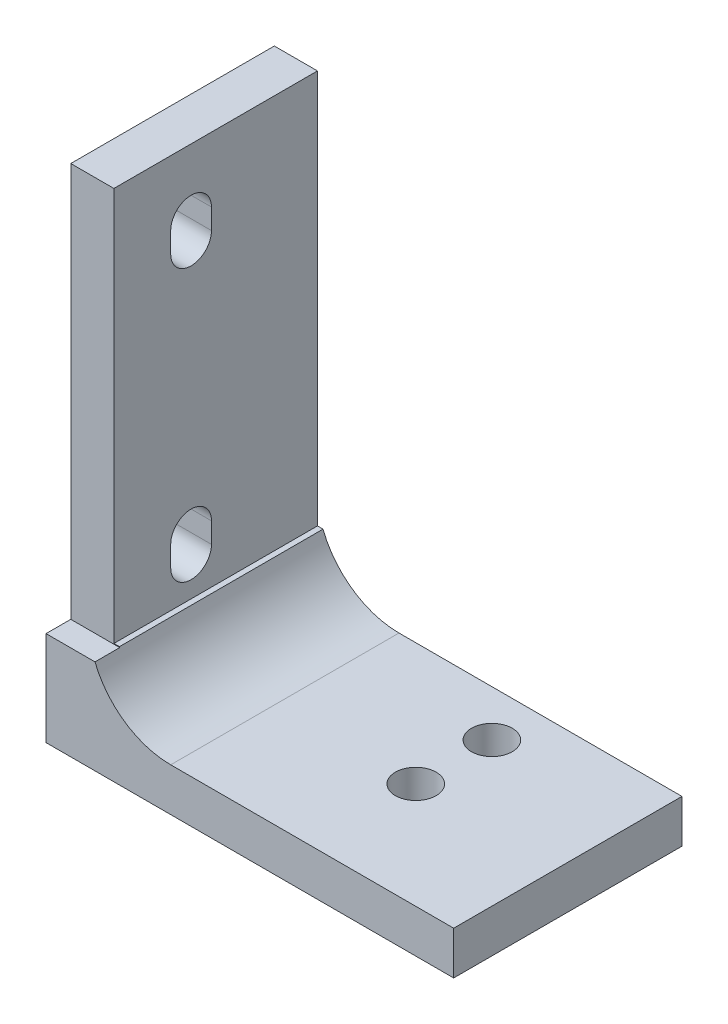
ISO-10303-21;
HEADER;
FILE_DESCRIPTION(('STEP AP214'),'2;1');
FILE_NAME('part.step','',(''),(''),'','','');
FILE_SCHEMA(('AUTOMOTIVE_DESIGN { 1 0 10303 214 1 1 1 1 }'));
ENDSEC;
DATA;
#1=APPLICATION_CONTEXT('core data for automotive mechanical design processes');
#2=APPLICATION_PROTOCOL_DEFINITION('international standard','automotive_design',2000,#1);
#3=PRODUCT_CONTEXT('',#1,'mechanical');
#4=PRODUCT('Part','Part','',(#3));
#5=PRODUCT_RELATED_PRODUCT_CATEGORY('part','',(#4));
#6=PRODUCT_DEFINITION_FORMATION('','',#4);
#7=PRODUCT_DEFINITION_CONTEXT('part definition',#1,'design');
#8=PRODUCT_DEFINITION('design','',#6,#7);
#9=PRODUCT_DEFINITION_SHAPE('','',#8);
#10=(LENGTH_UNIT() NAMED_UNIT(*) SI_UNIT(.MILLI.,.METRE.));
#11=(NAMED_UNIT(*) PLANE_ANGLE_UNIT() SI_UNIT($,.RADIAN.));
#12=(NAMED_UNIT(*) SI_UNIT($,.STERADIAN.) SOLID_ANGLE_UNIT());
#13=UNCERTAINTY_MEASURE_WITH_UNIT(LENGTH_MEASURE(1.E-05),#10,'distance_accuracy_value','');
#14=(GEOMETRIC_REPRESENTATION_CONTEXT(3) GLOBAL_UNCERTAINTY_ASSIGNED_CONTEXT((#13)) GLOBAL_UNIT_ASSIGNED_CONTEXT((#10,
#11,#12)) REPRESENTATION_CONTEXT('',''));
#15=CARTESIAN_POINT('',(0.,0.,0.));
#16=DIRECTION('',(0.,0.,1.));
#17=DIRECTION('',(1.,0.,0.));
#18=AXIS2_PLACEMENT_3D('',#15,#16,#17);
#19=CARTESIAN_POINT('',(0.,0.,-8.4));
#20=DIRECTION('',(0.,0.,1.));
#21=DIRECTION('',(1.,0.,0.));
#22=AXIS2_PLACEMENT_3D('',#19,#20,#21);
#23=PLANE('',#22);
#24=DIRECTION('',(0.,1.,0.));
#25=VECTOR('',#24,1.);
#26=CARTESIAN_POINT('',(3.175,3.175,-8.4));
#27=LINE('',#26,#25);
#28=CARTESIAN_POINT('',(3.175,7.,-8.4));
#29=VERTEX_POINT('',#28);
#30=CARTESIAN_POINT('',(3.175,36.,-8.4));
#31=VERTEX_POINT('',#30);
#32=EDGE_CURVE('E304',#29,#31,#27,.T.);
#33=ORIENTED_EDGE('',*,*,#32,.F.);
#34=DIRECTION('',(-1.,0.,0.));
#35=VECTOR('',#34,1.);
#36=CARTESIAN_POINT('',(0.,7.,-8.4));
#37=LINE('',#36,#35);
#38=CARTESIAN_POINT('',(3.58309737209239,7.,-8.4));
#39=VERTEX_POINT('',#38);
#40=EDGE_CURVE('E241',#39,#29,#37,.T.);
#41=ORIENTED_EDGE('',*,*,#40,.F.);
#42=CARTESIAN_POINT('',(9.175,9.175,-8.4));
#43=DIRECTION('',(0.,0.,1.));
#44=DIRECTION('',(1.,0.,0.));
#45=AXIS2_PLACEMENT_3D('',#42,#43,#44);
#46=CIRCLE('',#45,6.);
#47=CARTESIAN_POINT('',(9.175,3.175,-8.4));
#48=VERTEX_POINT('',#47);
#49=EDGE_CURVE('E202',#39,#48,#46,.T.);
#50=ORIENTED_EDGE('',*,*,#49,.T.);
#51=DIRECTION('',(-1.,0.,0.));
#52=VECTOR('',#51,1.);
#53=CARTESIAN_POINT('',(3.175,3.175,-8.4));
#54=LINE('',#53,#52);
#55=CARTESIAN_POINT('',(30.,3.175,-8.4));
#56=VERTEX_POINT('',#55);
#57=EDGE_CURVE('E301',#56,#48,#54,.T.);
#58=ORIENTED_EDGE('',*,*,#57,.F.);
#59=DIRECTION('',(0.,1.,0.));
#60=VECTOR('',#59,1.);
#61=CARTESIAN_POINT('',(30.,0.,-8.4));
#62=LINE('',#61,#60);
#63=CARTESIAN_POINT('',(30.,0.,-8.4));
#64=VERTEX_POINT('',#63);
#65=EDGE_CURVE('E298',#64,#56,#62,.T.);
#66=ORIENTED_EDGE('',*,*,#65,.F.);
#67=DIRECTION('',(1.,0.,0.));
#68=VECTOR('',#67,1.);
#69=CARTESIAN_POINT('',(0.,0.,-8.4));
#70=LINE('',#69,#68);
#71=CARTESIAN_POINT('',(0.,0.,-8.4));
#72=VERTEX_POINT('',#71);
#73=EDGE_CURVE('E295',#72,#64,#70,.T.);
#74=ORIENTED_EDGE('',*,*,#73,.F.);
#75=DIRECTION('',(0.,-1.,0.));
#76=VECTOR('',#75,1.);
#77=CARTESIAN_POINT('',(0.,0.,-8.4));
#78=LINE('',#77,#76);
#79=CARTESIAN_POINT('',(0.,36.,-8.4));
#80=VERTEX_POINT('',#79);
#81=EDGE_CURVE('E196',#80,#72,#78,.T.);
#82=ORIENTED_EDGE('',*,*,#81,.F.);
#83=DIRECTION('',(-1.,0.,0.));
#84=VECTOR('',#83,1.);
#85=CARTESIAN_POINT('',(0.,36.,-8.4));
#86=LINE('',#85,#84);
#87=EDGE_CURVE('E181',#31,#80,#86,.T.);
#88=ORIENTED_EDGE('',*,*,#87,.F.);
#89=EDGE_LOOP('',(#33,#41,#50,#58,#66,#74,#82,#88));
#90=FACE_BOUND('',#89,.T.);
#91=ADVANCED_FACE('F32',(#90),#23,.F.);
#92=CARTESIAN_POINT('',(0.,0.,8.4));
#93=DIRECTION('',(0.,0.,1.));
#94=DIRECTION('',(1.,0.,0.));
#95=AXIS2_PLACEMENT_3D('',#92,#93,#94);
#96=PLANE('',#95);
#97=DIRECTION('',(-1.,0.,0.));
#98=VECTOR('',#97,1.);
#99=CARTESIAN_POINT('',(7.,6.95,8.4));
#100=LINE('',#99,#98);
#101=CARTESIAN_POINT('',(3.60280339542833,6.95,8.4));
#102=VERTEX_POINT('',#101);
#103=CARTESIAN_POINT('',(0.,6.95,8.4));
#104=VERTEX_POINT('',#103);
#105=EDGE_CURVE('E319',#102,#104,#100,.T.);
#106=ORIENTED_EDGE('',*,*,#105,.T.);
#107=DIRECTION('',(0.,-1.,0.));
#108=VECTOR('',#107,1.);
#109=CARTESIAN_POINT('',(0.,0.,8.4));
#110=LINE('',#109,#108);
#111=CARTESIAN_POINT('',(0.,0.,8.4));
#112=VERTEX_POINT('',#111);
#113=EDGE_CURVE('E293',#104,#112,#110,.T.);
#114=ORIENTED_EDGE('',*,*,#113,.T.);
#115=DIRECTION('',(1.,0.,0.));
#116=VECTOR('',#115,1.);
#117=CARTESIAN_POINT('',(0.,0.,8.4));
#118=LINE('',#117,#116);
#119=CARTESIAN_POINT('',(30.,0.,8.4));
#120=VERTEX_POINT('',#119);
#121=EDGE_CURVE('E278',#112,#120,#118,.T.);
#122=ORIENTED_EDGE('',*,*,#121,.T.);
#123=DIRECTION('',(0.,1.,0.));
#124=VECTOR('',#123,1.);
#125=CARTESIAN_POINT('',(30.,0.,8.4));
#126=LINE('',#125,#124);
#127=CARTESIAN_POINT('',(30.,3.175,8.4));
#128=VERTEX_POINT('',#127);
#129=EDGE_CURVE('E287',#120,#128,#126,.T.);
#130=ORIENTED_EDGE('',*,*,#129,.T.);
#131=DIRECTION('',(-1.,0.,0.));
#132=VECTOR('',#131,1.);
#133=CARTESIAN_POINT('',(3.175,3.175,8.4));
#134=LINE('',#133,#132);
#135=CARTESIAN_POINT('',(9.175,3.175,8.4));
#136=VERTEX_POINT('',#135);
#137=EDGE_CURVE('E290',#128,#136,#134,.T.);
#138=ORIENTED_EDGE('',*,*,#137,.T.);
#139=CARTESIAN_POINT('',(9.175,9.175,8.4));
#140=DIRECTION('',(0.,0.,1.));
#141=DIRECTION('',(1.,0.,0.));
#142=AXIS2_PLACEMENT_3D('',#139,#140,#141);
#143=CIRCLE('',#142,6.);
#144=EDGE_CURVE('E199',#136,#102,#143,.F.);
#145=ORIENTED_EDGE('',*,*,#144,.T.);
#146=EDGE_LOOP('',(#106,#114,#122,#130,#138,#145));
#147=FACE_BOUND('',#146,.T.);
#148=ADVANCED_FACE('F317',(#147),#96,.T.);
#149=CARTESIAN_POINT('',(9.175,9.175,-8.4));
#150=DIRECTION('',(0.,0.,-1.));
#151=DIRECTION('',(-1.,0.,0.));
#152=AXIS2_PLACEMENT_3D('',#149,#150,#151);
#153=CYLINDRICAL_SURFACE('',#152,6.);
#154=CARTESIAN_POINT('',(9.175,9.175,6.58));
#155=DIRECTION('',(0.,0.,-1.));
#156=DIRECTION('',(0.,1.,0.));
#157=AXIS2_PLACEMENT_3D('',#154,#155,#156);
#158=CIRCLE('',#157,6.);
#159=CARTESIAN_POINT('',(3.58309737209239,7.,6.58));
#160=VERTEX_POINT('',#159);
#161=CARTESIAN_POINT('',(3.60280339542833,6.95,6.58));
#162=VERTEX_POINT('',#161);
#163=EDGE_CURVE('E46',#160,#162,#158,.F.);
#164=ORIENTED_EDGE('',*,*,#163,.T.);
#165=DIRECTION('',(0.,0.,-1.));
#166=VECTOR('',#165,1.);
#167=CARTESIAN_POINT('',(3.60280339542833,6.95,-8.4));
#168=LINE('',#167,#166);
#169=EDGE_CURVE('E232',#162,#102,#168,.F.);
#170=ORIENTED_EDGE('',*,*,#169,.T.);
#171=ORIENTED_EDGE('',*,*,#144,.F.);
#172=DIRECTION('',(0.,0.,1.));
#173=VECTOR('',#172,1.);
#174=CARTESIAN_POINT('',(9.175,3.175,8.4));
#175=LINE('',#174,#173);
#176=EDGE_CURVE('E187',#48,#136,#175,.T.);
#177=ORIENTED_EDGE('',*,*,#176,.F.);
#178=ORIENTED_EDGE('',*,*,#49,.F.);
#179=DIRECTION('',(0.,0.,-1.));
#180=VECTOR('',#179,1.);
#181=CARTESIAN_POINT('',(3.58309737209239,7.,-8.4));
#182=LINE('',#181,#180);
#183=EDGE_CURVE('E40',#160,#39,#182,.T.);
#184=ORIENTED_EDGE('',*,*,#183,.F.);
#185=EDGE_LOOP('',(#164,#170,#171,#177,#178,#184));
#186=FACE_BOUND('',#185,.T.);
#187=ADVANCED_FACE('F34',(#186),#153,.F.);
#188=CARTESIAN_POINT('',(10.,9.72499999999903,0.899999999999977));
#189=DIRECTION('',(-1.,0.,0.));
#190=DIRECTION('',(0.,0.,1.));
#191=AXIS2_PLACEMENT_3D('',#188,#189,#190);
#192=CYLINDRICAL_SURFACE('',#191,1.5);
#193=CARTESIAN_POINT('',(3.175,9.72499999999903,0.899999999999977));
#194=DIRECTION('',(1.,0.,0.));
#195=DIRECTION('',(0.,0.,-1.));
#196=AXIS2_PLACEMENT_3D('',#193,#194,#195);
#197=CIRCLE('',#196,1.5);
#198=CARTESIAN_POINT('',(3.175,9.72499999999903,2.39999999999998));
#199=VERTEX_POINT('',#198);
#200=CARTESIAN_POINT('',(3.175,9.72499999999903,-0.600000000000023));
#201=VERTEX_POINT('',#200);
#202=EDGE_CURVE('E257',#199,#201,#197,.T.);
#203=ORIENTED_EDGE('',*,*,#202,.T.);
#204=DIRECTION('',(-1.,0.,0.));
#205=VECTOR('',#204,1.);
#206=CARTESIAN_POINT('',(10.,9.72499999999903,-0.600000000000023));
#207=LINE('',#206,#205);
#208=CARTESIAN_POINT('',(0.,9.72499999999903,-0.600000000000023));
#209=VERTEX_POINT('',#208);
#210=EDGE_CURVE('E255',#201,#209,#207,.T.);
#211=ORIENTED_EDGE('',*,*,#210,.T.);
#212=CARTESIAN_POINT('',(0.,9.72499999999903,0.899999999999977));
#213=DIRECTION('',(-1.,0.,0.));
#214=DIRECTION('',(0.,0.,1.));
#215=AXIS2_PLACEMENT_3D('',#212,#213,#214);
#216=CIRCLE('',#215,1.5);
#217=CARTESIAN_POINT('',(0.,9.72499999999903,2.39999999999998));
#218=VERTEX_POINT('',#217);
#219=EDGE_CURVE('E54',#209,#218,#216,.T.);
#220=ORIENTED_EDGE('',*,*,#219,.T.);
#221=DIRECTION('',(-1.,0.,0.));
#222=VECTOR('',#221,1.);
#223=CARTESIAN_POINT('',(10.,9.72499999999903,2.39999999999998));
#224=LINE('',#223,#222);
#225=EDGE_CURVE('E254',#199,#218,#224,.T.);
#226=ORIENTED_EDGE('',*,*,#225,.F.);
#227=EDGE_LOOP('',(#203,#211,#220,#226));
#228=FACE_BOUND('',#227,.T.);
#229=ADVANCED_FACE('F391',(#228),#192,.F.);
#230=CARTESIAN_POINT('',(0.,0.,-8.4));
#231=DIRECTION('',(0.,-1.,0.));
#232=DIRECTION('',(0.,0.,-1.));
#233=AXIS2_PLACEMENT_3D('',#230,#231,#232);
#234=PLANE('',#233);
#235=CARTESIAN_POINT('',(19.4100000000006,0.,0.600000000000013));
#236=DIRECTION('',(0.,-1.,0.));
#237=DIRECTION('',(0.,0.,-1.));
#238=AXIS2_PLACEMENT_3D('',#235,#236,#237);
#239=CIRCLE('',#238,1.5);
#240=CARTESIAN_POINT('',(19.4100000000006,0.,-0.899999999999991));
#241=VERTEX_POINT('',#240);
#242=EDGE_CURVE('E226',#241,#241,#239,.T.);
#243=ORIENTED_EDGE('',*,*,#242,.F.);
#244=EDGE_LOOP('',(#243));
#245=FACE_BOUND('',#244,.T.);
#246=CARTESIAN_POINT('',(19.4100000000006,0.,-4.99999999999999));
#247=DIRECTION('',(0.,-1.,0.));
#248=DIRECTION('',(0.,0.,-1.));
#249=AXIS2_PLACEMENT_3D('',#246,#247,#248);
#250=CIRCLE('',#249,1.5);
#251=CARTESIAN_POINT('',(19.4100000000006,0.,-6.49999999999999));
#252=VERTEX_POINT('',#251);
#253=EDGE_CURVE('E223',#252,#252,#250,.T.);
#254=ORIENTED_EDGE('',*,*,#253,.F.);
#255=EDGE_LOOP('',(#254));
#256=FACE_BOUND('',#255,.T.);
#257=DIRECTION('',(0.,0.,1.));
#258=VECTOR('',#257,1.);
#259=CARTESIAN_POINT('',(30.,0.,-8.4));
#260=LINE('',#259,#258);
#261=EDGE_CURVE('E194',#64,#120,#260,.T.);
#262=ORIENTED_EDGE('',*,*,#261,.T.);
#263=ORIENTED_EDGE('',*,*,#121,.F.);
#264=DIRECTION('',(0.,0.,1.));
#265=VECTOR('',#264,1.);
#266=CARTESIAN_POINT('',(0.,0.,-8.4));
#267=LINE('',#266,#265);
#268=EDGE_CURVE('E183',#72,#112,#267,.T.);
#269=ORIENTED_EDGE('',*,*,#268,.F.);
#270=ORIENTED_EDGE('',*,*,#73,.T.);
#271=EDGE_LOOP('',(#262,#263,#269,#270));
#272=FACE_BOUND('',#271,.T.);
#273=ADVANCED_FACE('F313',(#245,#256,#272),#234,.T.);
#274=CARTESIAN_POINT('',(0.,0.,-8.4));
#275=DIRECTION('',(-1.,0.,0.));
#276=DIRECTION('',(0.,0.,1.));
#277=AXIS2_PLACEMENT_3D('',#274,#275,#276);
#278=PLANE('',#277);
#279=DIRECTION('',(0.,0.,1.));
#280=VECTOR('',#279,1.);
#281=CARTESIAN_POINT('',(0.,6.95,8.4));
#282=LINE('',#281,#280);
#283=CARTESIAN_POINT('',(0.,6.95,6.58));
#284=VERTEX_POINT('',#283);
#285=EDGE_CURVE('E169',#284,#104,#282,.T.);
#286=ORIENTED_EDGE('',*,*,#285,.F.);
#287=DIRECTION('',(0.,-1.,0.));
#288=VECTOR('',#287,1.);
#289=CARTESIAN_POINT('',(0.,36.,6.58));
#290=LINE('',#289,#288);
#291=CARTESIAN_POINT('',(0.,36.,6.58));
#292=VERTEX_POINT('',#291);
#293=EDGE_CURVE('E160',#292,#284,#290,.T.);
#294=ORIENTED_EDGE('',*,*,#293,.F.);
#295=DIRECTION('',(0.,0.,1.));
#296=VECTOR('',#295,1.);
#297=CARTESIAN_POINT('',(0.,36.,-8.4));
#298=LINE('',#297,#296);
#299=EDGE_CURVE('E175',#80,#292,#298,.T.);
#300=ORIENTED_EDGE('',*,*,#299,.F.);
#301=ORIENTED_EDGE('',*,*,#81,.T.);
#302=ORIENTED_EDGE('',*,*,#268,.T.);
#303=ORIENTED_EDGE('',*,*,#113,.F.);
#304=EDGE_LOOP('',(#286,#294,#300,#301,#302,#303));
#305=FACE_BOUND('',#304,.T.);
#306=ORIENTED_EDGE('',*,*,#219,.F.);
#307=DIRECTION('',(0.,-1.,0.));
#308=VECTOR('',#307,1.);
#309=CARTESIAN_POINT('',(0.,9.72499999999903,-0.600000000000023));
#310=LINE('',#309,#308);
#311=CARTESIAN_POINT('',(0.,11.224999999999,-0.600000000000023));
#312=VERTEX_POINT('',#311);
#313=EDGE_CURVE('E251',#312,#209,#310,.T.);
#314=ORIENTED_EDGE('',*,*,#313,.F.);
#315=CARTESIAN_POINT('',(0.,11.224999999999,0.899999999999977));
#316=DIRECTION('',(-1.,0.,0.));
#317=DIRECTION('',(0.,0.,1.));
#318=AXIS2_PLACEMENT_3D('',#315,#316,#317);
#319=CIRCLE('',#318,1.5);
#320=CARTESIAN_POINT('',(0.,11.224999999999,2.39999999999998));
#321=VERTEX_POINT('',#320);
#322=EDGE_CURVE('E248',#321,#312,#319,.T.);
#323=ORIENTED_EDGE('',*,*,#322,.F.);
#324=DIRECTION('',(0.,1.,0.));
#325=VECTOR('',#324,1.);
#326=CARTESIAN_POINT('',(0.,9.72499999999903,2.39999999999998));
#327=LINE('',#326,#325);
#328=EDGE_CURVE('E245',#218,#321,#327,.T.);
#329=ORIENTED_EDGE('',*,*,#328,.F.);
#330=EDGE_LOOP('',(#306,#314,#323,#329));
#331=FACE_BOUND('',#330,.T.);
#332=CARTESIAN_POINT('',(0.,31.224999999999,0.899999999999977));
#333=DIRECTION('',(-1.,0.,0.));
#334=DIRECTION('',(0.,0.,1.));
#335=AXIS2_PLACEMENT_3D('',#332,#333,#334);
#336=CIRCLE('',#335,1.5);
#337=CARTESIAN_POINT('',(0.,31.224999999999,2.39999999999998));
#338=VERTEX_POINT('',#337);
#339=CARTESIAN_POINT('',(0.,31.224999999999,-0.600000000000023));
#340=VERTEX_POINT('',#339);
#341=EDGE_CURVE('E264',#338,#340,#336,.T.);
#342=ORIENTED_EDGE('',*,*,#341,.F.);
#343=DIRECTION('',(0.,1.,0.));
#344=VECTOR('',#343,1.);
#345=CARTESIAN_POINT('',(0.,31.224999999999,2.39999999999998));
#346=LINE('',#345,#344);
#347=CARTESIAN_POINT('',(0.,29.724999999999,2.39999999999998));
#348=VERTEX_POINT('',#347);
#349=EDGE_CURVE('E272',#348,#338,#346,.T.);
#350=ORIENTED_EDGE('',*,*,#349,.F.);
#351=CARTESIAN_POINT('',(0.,29.724999999999,0.899999999999977));
#352=DIRECTION('',(-1.,0.,0.));
#353=DIRECTION('',(0.,0.,1.));
#354=AXIS2_PLACEMENT_3D('',#351,#352,#353);
#355=CIRCLE('',#354,1.5);
#356=CARTESIAN_POINT('',(0.,29.724999999999,-0.600000000000022));
#357=VERTEX_POINT('',#356);
#358=EDGE_CURVE('E269',#357,#348,#355,.T.);
#359=ORIENTED_EDGE('',*,*,#358,.F.);
#360=DIRECTION('',(0.,-1.,0.));
#361=VECTOR('',#360,1.);
#362=CARTESIAN_POINT('',(0.,31.224999999999,-0.600000000000023));
#363=LINE('',#362,#361);
#364=EDGE_CURVE('E266',#340,#357,#363,.T.);
#365=ORIENTED_EDGE('',*,*,#364,.F.);
#366=EDGE_LOOP('',(#342,#350,#359,#365));
#367=FACE_BOUND('',#366,.T.);
#368=ADVANCED_FACE('F172',(#305,#331,#367),#278,.T.);
#369=CARTESIAN_POINT('',(0.,36.,-8.4));
#370=DIRECTION('',(0.,1.,0.));
#371=DIRECTION('',(0.,0.,1.));
#372=AXIS2_PLACEMENT_3D('',#369,#370,#371);
#373=PLANE('',#372);
#374=DIRECTION('',(-1.,0.,0.));
#375=VECTOR('',#374,1.);
#376=CARTESIAN_POINT('',(7.,36.,6.58));
#377=LINE('',#376,#375);
#378=CARTESIAN_POINT('',(3.175,36.,6.58));
#379=VERTEX_POINT('',#378);
#380=EDGE_CURVE('E157',#379,#292,#377,.T.);
#381=ORIENTED_EDGE('',*,*,#380,.F.);
#382=DIRECTION('',(0.,0.,1.));
#383=VECTOR('',#382,1.);
#384=CARTESIAN_POINT('',(3.175,36.,-8.4));
#385=LINE('',#384,#383);
#386=EDGE_CURVE('E184',#31,#379,#385,.T.);
#387=ORIENTED_EDGE('',*,*,#386,.F.);
#388=ORIENTED_EDGE('',*,*,#87,.T.);
#389=ORIENTED_EDGE('',*,*,#299,.T.);
#390=EDGE_LOOP('',(#381,#387,#388,#389));
#391=FACE_BOUND('',#390,.T.);
#392=ADVANCED_FACE('F179',(#391),#373,.T.);
#393=CARTESIAN_POINT('',(3.175,3.175,-8.4));
#394=DIRECTION('',(1.,0.,0.));
#395=DIRECTION('',(0.,0.,-1.));
#396=AXIS2_PLACEMENT_3D('',#393,#394,#395);
#397=PLANE('',#396);
#398=DIRECTION('',(0.,1.,0.));
#399=VECTOR('',#398,1.);
#400=CARTESIAN_POINT('',(3.175,3.175,6.58));
#401=LINE('',#400,#399);
#402=CARTESIAN_POINT('',(3.175,7.,6.58));
#403=VERTEX_POINT('',#402);
#404=EDGE_CURVE('E163',#403,#379,#401,.T.);
#405=ORIENTED_EDGE('',*,*,#404,.F.);
#406=DIRECTION('',(0.,0.,-1.));
#407=VECTOR('',#406,1.);
#408=CARTESIAN_POINT('',(3.175,7.,10.));
#409=LINE('',#408,#407);
#410=EDGE_CURVE('E222',#403,#29,#409,.T.);
#411=ORIENTED_EDGE('',*,*,#410,.T.);
#412=ORIENTED_EDGE('',*,*,#32,.T.);
#413=ORIENTED_EDGE('',*,*,#386,.T.);
#414=EDGE_LOOP('',(#405,#411,#412,#413));
#415=FACE_BOUND('',#414,.T.);
#416=DIRECTION('',(0.,1.,0.));
#417=VECTOR('',#416,1.);
#418=CARTESIAN_POINT('',(3.175,3.175,-0.600000000000021));
#419=LINE('',#418,#417);
#420=CARTESIAN_POINT('',(3.175,11.224999999999,-0.600000000000023));
#421=VERTEX_POINT('',#420);
#422=EDGE_CURVE('E217',#201,#421,#419,.T.);
#423=ORIENTED_EDGE('',*,*,#422,.F.);
#424=ORIENTED_EDGE('',*,*,#202,.F.);
#425=DIRECTION('',(0.,-1.,0.));
#426=VECTOR('',#425,1.);
#427=CARTESIAN_POINT('',(3.175,3.175,2.39999999999998));
#428=LINE('',#427,#426);
#429=CARTESIAN_POINT('',(3.175,11.224999999999,2.39999999999998));
#430=VERTEX_POINT('',#429);
#431=EDGE_CURVE('E213',#430,#199,#428,.T.);
#432=ORIENTED_EDGE('',*,*,#431,.F.);
#433=CARTESIAN_POINT('',(3.175,11.224999999999,0.899999999999977));
#434=DIRECTION('',(1.,0.,0.));
#435=DIRECTION('',(0.,0.,-1.));
#436=AXIS2_PLACEMENT_3D('',#433,#434,#435);
#437=CIRCLE('',#436,1.5);
#438=EDGE_CURVE('E215',#421,#430,#437,.T.);
#439=ORIENTED_EDGE('',*,*,#438,.F.);
#440=EDGE_LOOP('',(#423,#424,#432,#439));
#441=FACE_BOUND('',#440,.T.);
#442=CARTESIAN_POINT('',(3.175,31.224999999999,0.899999999999977));
#443=DIRECTION('',(1.,0.,0.));
#444=DIRECTION('',(0.,0.,-1.));
#445=AXIS2_PLACEMENT_3D('',#442,#443,#444);
#446=CIRCLE('',#445,1.5);
#447=CARTESIAN_POINT('',(3.175,31.224999999999,-0.600000000000023));
#448=VERTEX_POINT('',#447);
#449=CARTESIAN_POINT('',(3.175,31.224999999999,2.39999999999998));
#450=VERTEX_POINT('',#449);
#451=EDGE_CURVE('E211',#448,#450,#446,.T.);
#452=ORIENTED_EDGE('',*,*,#451,.F.);
#453=DIRECTION('',(0.,1.,0.));
#454=VECTOR('',#453,1.);
#455=CARTESIAN_POINT('',(3.175,3.175,-0.600000000000015));
#456=LINE('',#455,#454);
#457=CARTESIAN_POINT('',(3.175,29.724999999999,-0.600000000000022));
#458=VERTEX_POINT('',#457);
#459=EDGE_CURVE('E204',#458,#448,#456,.T.);
#460=ORIENTED_EDGE('',*,*,#459,.F.);
#461=CARTESIAN_POINT('',(3.175,29.724999999999,0.899999999999977));
#462=DIRECTION('',(1.,0.,0.));
#463=DIRECTION('',(0.,0.,-1.));
#464=AXIS2_PLACEMENT_3D('',#461,#462,#463);
#465=CIRCLE('',#464,1.5);
#466=CARTESIAN_POINT('',(3.175,29.724999999999,2.39999999999998));
#467=VERTEX_POINT('',#466);
#468=EDGE_CURVE('E206',#467,#458,#465,.T.);
#469=ORIENTED_EDGE('',*,*,#468,.F.);
#470=DIRECTION('',(0.,-1.,0.));
#471=VECTOR('',#470,1.);
#472=CARTESIAN_POINT('',(3.175,3.175,2.39999999999999));
#473=LINE('',#472,#471);
#474=EDGE_CURVE('E209',#450,#467,#473,.T.);
#475=ORIENTED_EDGE('',*,*,#474,.F.);
#476=EDGE_LOOP('',(#452,#460,#469,#475));
#477=FACE_BOUND('',#476,.T.);
#478=ADVANCED_FACE('F334',(#415,#441,#477),#397,.T.);
#479=CARTESIAN_POINT('',(3.175,3.175,-8.4));
#480=DIRECTION('',(0.,1.,0.));
#481=DIRECTION('',(0.,0.,1.));
#482=AXIS2_PLACEMENT_3D('',#479,#480,#481);
#483=PLANE('',#482);
#484=CARTESIAN_POINT('',(19.4100000000006,3.175,0.600000000000013));
#485=DIRECTION('',(0.,1.,0.));
#486=DIRECTION('',(0.,0.,1.));
#487=AXIS2_PLACEMENT_3D('',#484,#485,#486);
#488=CIRCLE('',#487,1.5);
#489=CARTESIAN_POINT('',(19.4100000000006,3.175,2.10000000000002));
#490=VERTEX_POINT('',#489);
#491=EDGE_CURVE('E224',#490,#490,#488,.T.);
#492=ORIENTED_EDGE('',*,*,#491,.F.);
#493=EDGE_LOOP('',(#492));
#494=FACE_BOUND('',#493,.T.);
#495=CARTESIAN_POINT('',(19.4100000000006,3.175,-4.99999999999999));
#496=DIRECTION('',(0.,1.,0.));
#497=DIRECTION('',(0.,0.,1.));
#498=AXIS2_PLACEMENT_3D('',#495,#496,#497);
#499=CIRCLE('',#498,1.5);
#500=CARTESIAN_POINT('',(19.4100000000006,3.175,-3.49999999999998));
#501=VERTEX_POINT('',#500);
#502=EDGE_CURVE('E220',#501,#501,#499,.T.);
#503=ORIENTED_EDGE('',*,*,#502,.F.);
#504=EDGE_LOOP('',(#503));
#505=FACE_BOUND('',#504,.T.);
#506=ORIENTED_EDGE('',*,*,#57,.T.);
#507=ORIENTED_EDGE('',*,*,#176,.T.);
#508=ORIENTED_EDGE('',*,*,#137,.F.);
#509=DIRECTION('',(0.,0.,1.));
#510=VECTOR('',#509,1.);
#511=CARTESIAN_POINT('',(30.,3.175,-8.4));
#512=LINE('',#511,#510);
#513=EDGE_CURVE('E189',#56,#128,#512,.T.);
#514=ORIENTED_EDGE('',*,*,#513,.F.);
#515=EDGE_LOOP('',(#506,#507,#508,#514));
#516=FACE_BOUND('',#515,.T.);
#517=ADVANCED_FACE('F337',(#494,#505,#516),#483,.T.);
#518=CARTESIAN_POINT('',(30.,0.,-8.4));
#519=DIRECTION('',(1.,0.,0.));
#520=DIRECTION('',(0.,0.,-1.));
#521=AXIS2_PLACEMENT_3D('',#518,#519,#520);
#522=PLANE('',#521);
#523=ORIENTED_EDGE('',*,*,#513,.T.);
#524=ORIENTED_EDGE('',*,*,#129,.F.);
#525=ORIENTED_EDGE('',*,*,#261,.F.);
#526=ORIENTED_EDGE('',*,*,#65,.T.);
#527=EDGE_LOOP('',(#523,#524,#525,#526));
#528=FACE_BOUND('',#527,.T.);
#529=ADVANCED_FACE('F386',(#528),#522,.T.);
#530=CARTESIAN_POINT('',(10.,31.224999999999,0.899999999999977));
#531=DIRECTION('',(-1.,0.,0.));
#532=DIRECTION('',(0.,0.,1.));
#533=AXIS2_PLACEMENT_3D('',#530,#531,#532);
#534=CYLINDRICAL_SURFACE('',#533,1.5);
#535=ORIENTED_EDGE('',*,*,#451,.T.);
#536=DIRECTION('',(-1.,0.,0.));
#537=VECTOR('',#536,1.);
#538=CARTESIAN_POINT('',(10.,31.224999999999,2.39999999999998));
#539=LINE('',#538,#537);
#540=EDGE_CURVE('E276',#450,#338,#539,.T.);
#541=ORIENTED_EDGE('',*,*,#540,.T.);
#542=ORIENTED_EDGE('',*,*,#341,.T.);
#543=DIRECTION('',(-1.,0.,0.));
#544=VECTOR('',#543,1.);
#545=CARTESIAN_POINT('',(10.,31.224999999999,-0.600000000000023));
#546=LINE('',#545,#544);
#547=EDGE_CURVE('E275',#448,#340,#546,.T.);
#548=ORIENTED_EDGE('',*,*,#547,.F.);
#549=EDGE_LOOP('',(#535,#541,#542,#548));
#550=FACE_BOUND('',#549,.T.);
#551=ADVANCED_FACE('F350',(#550),#534,.F.);
#552=CARTESIAN_POINT('',(10.,31.224999999999,2.39999999999998));
#553=DIRECTION('',(0.,0.,1.));
#554=DIRECTION('',(0.,-1.,0.));
#555=AXIS2_PLACEMENT_3D('',#552,#553,#554);
#556=PLANE('',#555);
#557=ORIENTED_EDGE('',*,*,#474,.T.);
#558=DIRECTION('',(-1.,0.,0.));
#559=VECTOR('',#558,1.);
#560=CARTESIAN_POINT('',(10.,29.724999999999,2.39999999999998));
#561=LINE('',#560,#559);
#562=EDGE_CURVE('E279',#467,#348,#561,.T.);
#563=ORIENTED_EDGE('',*,*,#562,.T.);
#564=ORIENTED_EDGE('',*,*,#349,.T.);
#565=ORIENTED_EDGE('',*,*,#540,.F.);
#566=EDGE_LOOP('',(#557,#563,#564,#565));
#567=FACE_BOUND('',#566,.T.);
#568=ADVANCED_FACE('F352',(#567),#556,.F.);
#569=CARTESIAN_POINT('',(10.,29.724999999999,0.899999999999977));
#570=DIRECTION('',(-1.,0.,0.));
#571=DIRECTION('',(0.,0.,1.));
#572=AXIS2_PLACEMENT_3D('',#569,#570,#571);
#573=CYLINDRICAL_SURFACE('',#572,1.5);
#574=ORIENTED_EDGE('',*,*,#468,.T.);
#575=DIRECTION('',(-1.,0.,0.));
#576=VECTOR('',#575,1.);
#577=CARTESIAN_POINT('',(10.,29.724999999999,-0.600000000000022));
#578=LINE('',#577,#576);
#579=EDGE_CURVE('E281',#458,#357,#578,.T.);
#580=ORIENTED_EDGE('',*,*,#579,.T.);
#581=ORIENTED_EDGE('',*,*,#358,.T.);
#582=ORIENTED_EDGE('',*,*,#562,.F.);
#583=EDGE_LOOP('',(#574,#580,#581,#582));
#584=FACE_BOUND('',#583,.T.);
#585=ADVANCED_FACE('F362',(#584),#573,.F.);
#586=CARTESIAN_POINT('',(10.,31.224999999999,-0.600000000000023));
#587=DIRECTION('',(0.,0.,-1.));
#588=DIRECTION('',(0.,1.,0.));
#589=AXIS2_PLACEMENT_3D('',#586,#587,#588);
#590=PLANE('',#589);
#591=ORIENTED_EDGE('',*,*,#459,.T.);
#592=ORIENTED_EDGE('',*,*,#547,.T.);
#593=ORIENTED_EDGE('',*,*,#364,.T.);
#594=ORIENTED_EDGE('',*,*,#579,.F.);
#595=EDGE_LOOP('',(#591,#592,#593,#594));
#596=FACE_BOUND('',#595,.T.);
#597=ADVANCED_FACE('F360',(#596),#590,.F.);
#598=CARTESIAN_POINT('',(10.,9.72499999999903,-0.600000000000023));
#599=DIRECTION('',(0.,0.,-1.));
#600=DIRECTION('',(0.,1.,0.));
#601=AXIS2_PLACEMENT_3D('',#598,#599,#600);
#602=PLANE('',#601);
#603=ORIENTED_EDGE('',*,*,#422,.T.);
#604=DIRECTION('',(-1.,0.,0.));
#605=VECTOR('',#604,1.);
#606=CARTESIAN_POINT('',(10.,11.224999999999,-0.600000000000023));
#607=LINE('',#606,#605);
#608=EDGE_CURVE('E258',#421,#312,#607,.T.);
#609=ORIENTED_EDGE('',*,*,#608,.T.);
#610=ORIENTED_EDGE('',*,*,#313,.T.);
#611=ORIENTED_EDGE('',*,*,#210,.F.);
#612=EDGE_LOOP('',(#603,#609,#610,#611));
#613=FACE_BOUND('',#612,.T.);
#614=ADVANCED_FACE('F369',(#613),#602,.F.);
#615=CARTESIAN_POINT('',(10.,11.224999999999,0.899999999999977));
#616=DIRECTION('',(-1.,0.,0.));
#617=DIRECTION('',(0.,0.,1.));
#618=AXIS2_PLACEMENT_3D('',#615,#616,#617);
#619=CYLINDRICAL_SURFACE('',#618,1.5);
#620=ORIENTED_EDGE('',*,*,#438,.T.);
#621=DIRECTION('',(-1.,0.,0.));
#622=VECTOR('',#621,1.);
#623=CARTESIAN_POINT('',(10.,11.224999999999,2.39999999999998));
#624=LINE('',#623,#622);
#625=EDGE_CURVE('E260',#430,#321,#624,.T.);
#626=ORIENTED_EDGE('',*,*,#625,.T.);
#627=ORIENTED_EDGE('',*,*,#322,.T.);
#628=ORIENTED_EDGE('',*,*,#608,.F.);
#629=EDGE_LOOP('',(#620,#626,#627,#628));
#630=FACE_BOUND('',#629,.T.);
#631=ADVANCED_FACE('F417',(#630),#619,.F.);
#632=CARTESIAN_POINT('',(10.,9.72499999999903,2.39999999999998));
#633=DIRECTION('',(0.,0.,1.));
#634=DIRECTION('',(0.,-1.,0.));
#635=AXIS2_PLACEMENT_3D('',#632,#633,#634);
#636=PLANE('',#635);
#637=ORIENTED_EDGE('',*,*,#431,.T.);
#638=ORIENTED_EDGE('',*,*,#225,.T.);
#639=ORIENTED_EDGE('',*,*,#328,.T.);
#640=ORIENTED_EDGE('',*,*,#625,.F.);
#641=EDGE_LOOP('',(#637,#638,#639,#640));
#642=FACE_BOUND('',#641,.T.);
#643=ADVANCED_FACE('F411',(#642),#636,.F.);
#644=CARTESIAN_POINT('',(3.175,7.,10.));
#645=DIRECTION('',(0.,1.,0.));
#646=DIRECTION('',(0.,0.,1.));
#647=AXIS2_PLACEMENT_3D('',#644,#645,#646);
#648=PLANE('',#647);
#649=DIRECTION('',(-1.,0.,0.));
#650=VECTOR('',#649,1.);
#651=CARTESIAN_POINT('',(3.175,7.,6.58));
#652=LINE('',#651,#650);
#653=EDGE_CURVE('E11',#160,#403,#652,.T.);
#654=ORIENTED_EDGE('',*,*,#653,.F.);
#655=ORIENTED_EDGE('',*,*,#183,.T.);
#656=ORIENTED_EDGE('',*,*,#40,.T.);
#657=ORIENTED_EDGE('',*,*,#410,.F.);
#658=EDGE_LOOP('',(#654,#655,#656,#657));
#659=FACE_BOUND('',#658,.T.);
#660=ADVANCED_FACE('F331',(#659),#648,.T.);
#661=CARTESIAN_POINT('',(19.4100000000006,7.,-4.99999999999999));
#662=DIRECTION('',(0.,-1.,0.));
#663=DIRECTION('',(0.,0.,-1.));
#664=AXIS2_PLACEMENT_3D('',#661,#662,#663);
#665=CYLINDRICAL_SURFACE('',#664,1.5);
#666=ORIENTED_EDGE('',*,*,#502,.T.);
#667=EDGE_LOOP('',(#666));
#668=FACE_BOUND('',#667,.T.);
#669=ORIENTED_EDGE('',*,*,#253,.T.);
#670=EDGE_LOOP('',(#669));
#671=FACE_BOUND('',#670,.T.);
#672=ADVANCED_FACE('F400',(#668,#671),#665,.F.);
#673=CARTESIAN_POINT('',(19.4100000000006,7.,0.600000000000013));
#674=DIRECTION('',(0.,-1.,0.));
#675=DIRECTION('',(0.,0.,-1.));
#676=AXIS2_PLACEMENT_3D('',#673,#674,#675);
#677=CYLINDRICAL_SURFACE('',#676,1.5);
#678=ORIENTED_EDGE('',*,*,#491,.T.);
#679=EDGE_LOOP('',(#678));
#680=FACE_BOUND('',#679,.T.);
#681=ORIENTED_EDGE('',*,*,#242,.T.);
#682=EDGE_LOOP('',(#681));
#683=FACE_BOUND('',#682,.T.);
#684=ADVANCED_FACE('F402',(#680,#683),#677,.F.);
#685=CARTESIAN_POINT('',(7.,6.95,8.4));
#686=DIRECTION('',(0.,-1.,0.));
#687=DIRECTION('',(0.,0.,-1.));
#688=AXIS2_PLACEMENT_3D('',#685,#686,#687);
#689=PLANE('',#688);
#690=DIRECTION('',(-1.,0.,0.));
#691=VECTOR('',#690,1.);
#692=CARTESIAN_POINT('',(7.,6.95,6.58));
#693=LINE('',#692,#691);
#694=EDGE_CURVE('E168',#162,#284,#693,.T.);
#695=ORIENTED_EDGE('',*,*,#694,.T.);
#696=ORIENTED_EDGE('',*,*,#285,.T.);
#697=ORIENTED_EDGE('',*,*,#105,.F.);
#698=ORIENTED_EDGE('',*,*,#169,.F.);
#699=EDGE_LOOP('',(#695,#696,#697,#698));
#700=FACE_BOUND('',#699,.T.);
#701=ADVANCED_FACE('F409',(#700),#689,.F.);
#702=CARTESIAN_POINT('',(7.,36.,6.58));
#703=DIRECTION('',(0.,0.,-1.));
#704=DIRECTION('',(0.,1.,0.));
#705=AXIS2_PLACEMENT_3D('',#702,#703,#704);
#706=PLANE('',#705);
#707=ORIENTED_EDGE('',*,*,#653,.T.);
#708=ORIENTED_EDGE('',*,*,#404,.T.);
#709=ORIENTED_EDGE('',*,*,#380,.T.);
#710=ORIENTED_EDGE('',*,*,#293,.T.);
#711=ORIENTED_EDGE('',*,*,#694,.F.);
#712=ORIENTED_EDGE('',*,*,#163,.F.);
#713=EDGE_LOOP('',(#707,#708,#709,#710,#711,#712));
#714=FACE_BOUND('',#713,.T.);
#715=ADVANCED_FACE('F159',(#714),#706,.F.);
#716=CLOSED_SHELL('',(#91,#148,#187,#229,#273,#368,#392,#478,#517,#529,#551,#568,#585,#597,#614,
#631,#643,#660,#672,#684,#701,#715));
#717=MANIFOLD_SOLID_BREP('B2',#716);
#718=ADVANCED_BREP_SHAPE_REPRESENTATION('',(#18,#717),#14);
#719=SHAPE_DEFINITION_REPRESENTATION(#9,#718);
ENDSEC;
END-ISO-10303-21;
